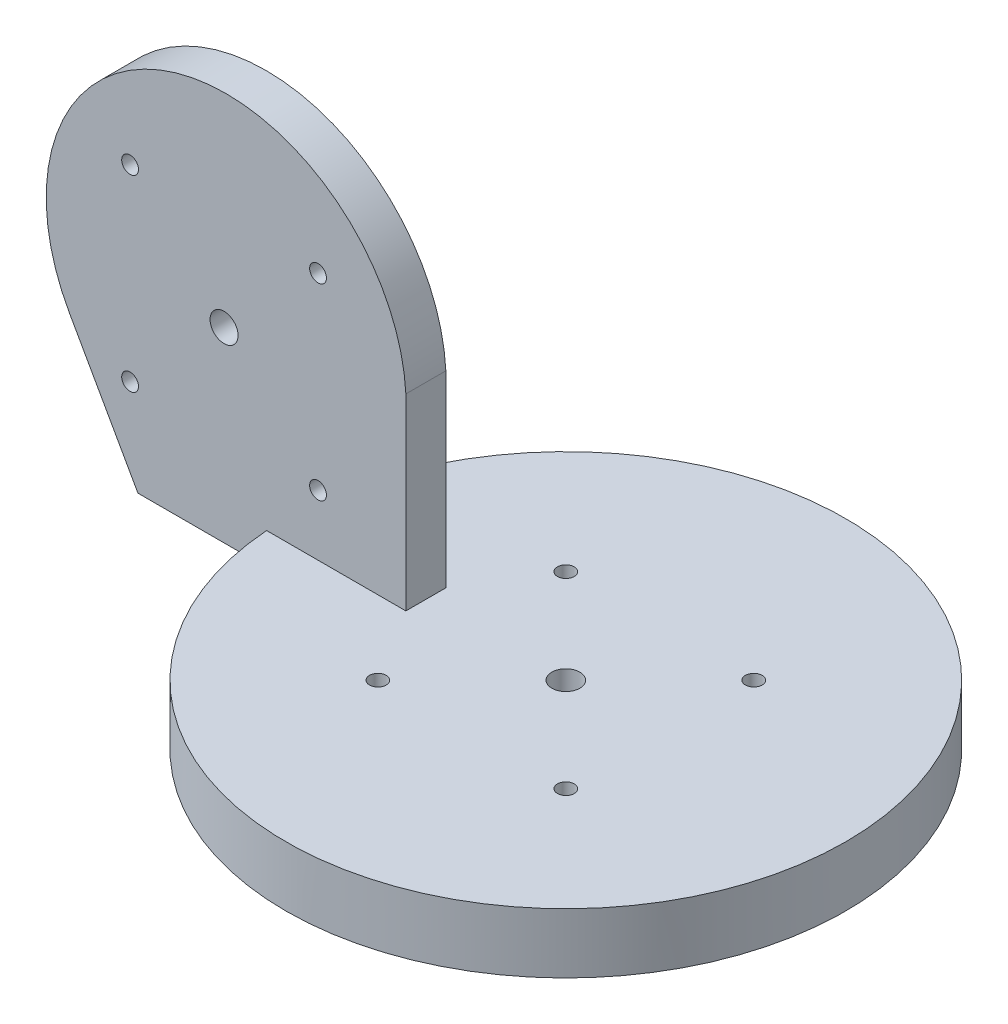
ISO-10303-21;
HEADER;
FILE_DESCRIPTION(('STEP AP214'),'2;1');
FILE_NAME('part.step','',(''),(''),'','','');
FILE_SCHEMA(('AUTOMOTIVE_DESIGN { 1 0 10303 214 1 1 1 1 }'));
ENDSEC;
DATA;
#1=APPLICATION_CONTEXT('core data for automotive mechanical design processes');
#2=APPLICATION_PROTOCOL_DEFINITION('international standard','automotive_design',2000,#1);
#3=PRODUCT_CONTEXT('',#1,'mechanical');
#4=PRODUCT('Part','Part','',(#3));
#5=PRODUCT_RELATED_PRODUCT_CATEGORY('part','',(#4));
#6=PRODUCT_DEFINITION_FORMATION('','',#4);
#7=PRODUCT_DEFINITION_CONTEXT('part definition',#1,'design');
#8=PRODUCT_DEFINITION('design','',#6,#7);
#9=PRODUCT_DEFINITION_SHAPE('','',#8);
#10=(LENGTH_UNIT() NAMED_UNIT(*) SI_UNIT(.MILLI.,.METRE.));
#11=(NAMED_UNIT(*) PLANE_ANGLE_UNIT() SI_UNIT($,.RADIAN.));
#12=(NAMED_UNIT(*) SI_UNIT($,.STERADIAN.) SOLID_ANGLE_UNIT());
#13=UNCERTAINTY_MEASURE_WITH_UNIT(LENGTH_MEASURE(1.E-05),#10,'distance_accuracy_value','');
#14=(GEOMETRIC_REPRESENTATION_CONTEXT(3) GLOBAL_UNCERTAINTY_ASSIGNED_CONTEXT((#13)) GLOBAL_UNIT_ASSIGNED_CONTEXT((#10,
#11,#12)) REPRESENTATION_CONTEXT('',''));
#15=CARTESIAN_POINT('',(0.,0.,0.));
#16=DIRECTION('',(0.,0.,1.));
#17=DIRECTION('',(1.,0.,0.));
#18=AXIS2_PLACEMENT_3D('',#15,#16,#17);
#19=CARTESIAN_POINT('',(0.,15.,0.));
#20=DIRECTION('',(0.,-1.,0.));
#21=DIRECTION('',(0.,0.,-1.));
#22=AXIS2_PLACEMENT_3D('',#19,#20,#21);
#23=CYLINDRICAL_SURFACE('',#22,70.);
#24=CARTESIAN_POINT('',(0.,0.,0.));
#25=DIRECTION('',(0.,1.,0.));
#26=DIRECTION('',(0.,0.,1.));
#27=AXIS2_PLACEMENT_3D('',#24,#25,#26);
#28=CIRCLE('',#27,70.);
#29=CARTESIAN_POINT('',(0.,0.,70.));
#30=VERTEX_POINT('',#29);
#31=EDGE_CURVE('E171',#30,#30,#28,.T.);
#32=ORIENTED_EDGE('',*,*,#31,.T.);
#33=EDGE_LOOP('',(#32));
#34=FACE_BOUND('',#33,.T.);
#35=DIRECTION('',(0.,-1.,0.));
#36=VECTOR('',#35,1.);
#37=CARTESIAN_POINT('',(-69.8212002188447,15.,5.));
#38=LINE('',#37,#36);
#39=CARTESIAN_POINT('',(-69.8212002188447,6.99999999999998,5.));
#40=VERTEX_POINT('',#39);
#41=CARTESIAN_POINT('',(-69.8212002188447,15.,5.));
#42=VERTEX_POINT('',#41);
#43=EDGE_CURVE('E54',#40,#42,#38,.F.);
#44=ORIENTED_EDGE('',*,*,#43,.F.);
#45=CARTESIAN_POINT('',(0.,7.,0.));
#46=DIRECTION('',(0.,-1.,0.));
#47=DIRECTION('',(1.,0.,0.));
#48=AXIS2_PLACEMENT_3D('',#45,#46,#47);
#49=CIRCLE('',#48,70.);
#50=CARTESIAN_POINT('',(-69.8212002188447,6.99999999999997,-5.));
#51=VERTEX_POINT('',#50);
#52=EDGE_CURVE('E11',#40,#51,#49,.T.);
#53=ORIENTED_EDGE('',*,*,#52,.T.);
#54=DIRECTION('',(0.,-1.,0.));
#55=VECTOR('',#54,1.);
#56=CARTESIAN_POINT('',(-69.8212002188447,15.,-5.));
#57=LINE('',#56,#55);
#58=CARTESIAN_POINT('',(-69.8212002188447,15.,-5.));
#59=VERTEX_POINT('',#58);
#60=EDGE_CURVE('E162',#51,#59,#57,.F.);
#61=ORIENTED_EDGE('',*,*,#60,.T.);
#62=CARTESIAN_POINT('',(0.,15.,0.));
#63=DIRECTION('',(0.,1.,0.));
#64=DIRECTION('',(0.,0.,1.));
#65=AXIS2_PLACEMENT_3D('',#62,#63,#64);
#66=CIRCLE('',#65,70.);
#67=EDGE_CURVE('E176',#42,#59,#66,.T.);
#68=ORIENTED_EDGE('',*,*,#67,.F.);
#69=EDGE_LOOP('',(#44,#53,#61,#68));
#70=FACE_BOUND('',#69,.T.);
#71=ADVANCED_FACE('F40',(#34,#70),#23,.T.);
#72=CARTESIAN_POINT('',(0.,15.,0.));
#73=DIRECTION('',(0.,1.,0.));
#74=DIRECTION('',(0.,0.,1.));
#75=AXIS2_PLACEMENT_3D('',#72,#73,#74);
#76=PLANE('',#75);
#77=CARTESIAN_POINT('',(0.,15.,0.));
#78=DIRECTION('',(0.,1.,0.));
#79=DIRECTION('',(0.,0.,1.));
#80=AXIS2_PLACEMENT_3D('',#77,#78,#79);
#81=CIRCLE('',#80,3.5);
#82=CARTESIAN_POINT('',(0.,15.,3.5));
#83=VERTEX_POINT('',#82);
#84=EDGE_CURVE('E336',#83,#83,#81,.T.);
#85=ORIENTED_EDGE('',*,*,#84,.F.);
#86=EDGE_LOOP('',(#85));
#87=FACE_BOUND('',#86,.T.);
#88=CARTESIAN_POINT('',(-23.5,15.,-23.5));
#89=DIRECTION('',(0.,1.,0.));
#90=DIRECTION('',(0.,0.,1.));
#91=AXIS2_PLACEMENT_3D('',#88,#89,#90);
#92=CIRCLE('',#91,2.09999999999999);
#93=CARTESIAN_POINT('',(-23.5,15.,-21.4));
#94=VERTEX_POINT('',#93);
#95=EDGE_CURVE('E112',#94,#94,#92,.T.);
#96=ORIENTED_EDGE('',*,*,#95,.F.);
#97=EDGE_LOOP('',(#96));
#98=FACE_BOUND('',#97,.T.);
#99=CARTESIAN_POINT('',(23.5,15.,-23.5));
#100=DIRECTION('',(0.,1.,0.));
#101=DIRECTION('',(0.,0.,1.));
#102=AXIS2_PLACEMENT_3D('',#99,#100,#101);
#103=CIRCLE('',#102,2.09999999999999);
#104=CARTESIAN_POINT('',(23.5,15.,-21.4));
#105=VERTEX_POINT('',#104);
#106=EDGE_CURVE('E111',#105,#105,#103,.T.);
#107=ORIENTED_EDGE('',*,*,#106,.F.);
#108=EDGE_LOOP('',(#107));
#109=FACE_BOUND('',#108,.T.);
#110=CARTESIAN_POINT('',(23.5,15.,23.5));
#111=DIRECTION('',(0.,1.,0.));
#112=DIRECTION('',(0.,0.,1.));
#113=AXIS2_PLACEMENT_3D('',#110,#111,#112);
#114=CIRCLE('',#113,2.09999999999999);
#115=CARTESIAN_POINT('',(23.5,15.,25.6));
#116=VERTEX_POINT('',#115);
#117=EDGE_CURVE('E124',#116,#116,#114,.T.);
#118=ORIENTED_EDGE('',*,*,#117,.F.);
#119=EDGE_LOOP('',(#118));
#120=FACE_BOUND('',#119,.T.);
#121=CARTESIAN_POINT('',(-23.5,15.,23.5));
#122=DIRECTION('',(0.,1.,0.));
#123=DIRECTION('',(0.,0.,1.));
#124=AXIS2_PLACEMENT_3D('',#121,#122,#123);
#125=CIRCLE('',#124,2.09999999999999);
#126=CARTESIAN_POINT('',(-23.5,15.,25.6));
#127=VERTEX_POINT('',#126);
#128=EDGE_CURVE('E130',#127,#127,#125,.T.);
#129=ORIENTED_EDGE('',*,*,#128,.F.);
#130=EDGE_LOOP('',(#129));
#131=FACE_BOUND('',#130,.T.);
#132=DIRECTION('',(0.,0.,-1.));
#133=VECTOR('',#132,1.);
#134=CARTESIAN_POINT('',(-35.,15.,0.));
#135=LINE('',#134,#133);
#136=CARTESIAN_POINT('',(-35.,15.,5.));
#137=VERTEX_POINT('',#136);
#138=CARTESIAN_POINT('',(-35.,15.,-5.));
#139=VERTEX_POINT('',#138);
#140=EDGE_CURVE('E182',#137,#139,#135,.T.);
#141=ORIENTED_EDGE('',*,*,#140,.F.);
#142=DIRECTION('',(-1.,0.,0.));
#143=VECTOR('',#142,1.);
#144=CARTESIAN_POINT('',(0.,15.,5.));
#145=LINE('',#144,#143);
#146=EDGE_CURVE('E48',#137,#42,#145,.T.);
#147=ORIENTED_EDGE('',*,*,#146,.T.);
#148=ORIENTED_EDGE('',*,*,#67,.T.);
#149=DIRECTION('',(-1.,0.,0.));
#150=VECTOR('',#149,1.);
#151=CARTESIAN_POINT('',(0.,15.,-5.));
#152=LINE('',#151,#150);
#153=EDGE_CURVE('E175',#139,#59,#152,.T.);
#154=ORIENTED_EDGE('',*,*,#153,.F.);
#155=EDGE_LOOP('',(#141,#147,#148,#154));
#156=FACE_BOUND('',#155,.T.);
#157=ADVANCED_FACE('F187',(#87,#98,#109,#120,#131,#156),#76,.T.);
#158=CARTESIAN_POINT('',(0.,0.,0.));
#159=DIRECTION('',(0.,1.,0.));
#160=DIRECTION('',(0.,0.,1.));
#161=AXIS2_PLACEMENT_3D('',#158,#159,#160);
#162=PLANE('',#161);
#163=CARTESIAN_POINT('',(0.,0.,0.));
#164=DIRECTION('',(0.,-1.,0.));
#165=DIRECTION('',(0.,0.,-1.));
#166=AXIS2_PLACEMENT_3D('',#163,#164,#165);
#167=CIRCLE('',#166,65.);
#168=CARTESIAN_POINT('',(0.,0.,-65.));
#169=VERTEX_POINT('',#168);
#170=EDGE_CURVE('E172',#169,#169,#167,.T.);
#171=ORIENTED_EDGE('',*,*,#170,.F.);
#172=EDGE_LOOP('',(#171));
#173=FACE_BOUND('',#172,.T.);
#174=ORIENTED_EDGE('',*,*,#31,.F.);
#175=EDGE_LOOP('',(#174));
#176=FACE_BOUND('',#175,.T.);
#177=ADVANCED_FACE('F226',(#173,#176),#162,.F.);
#178=CARTESIAN_POINT('',(0.,-3.,0.));
#179=DIRECTION('',(0.,1.,0.));
#180=DIRECTION('',(0.,0.,1.));
#181=AXIS2_PLACEMENT_3D('',#178,#179,#180);
#182=CYLINDRICAL_SURFACE('',#181,65.);
#183=CARTESIAN_POINT('',(0.,-3.,0.));
#184=DIRECTION('',(0.,-1.,0.));
#185=DIRECTION('',(0.,0.,-1.));
#186=AXIS2_PLACEMENT_3D('',#183,#184,#185);
#187=CIRCLE('',#186,65.);
#188=CARTESIAN_POINT('',(0.,-3.,-65.));
#189=VERTEX_POINT('',#188);
#190=EDGE_CURVE('E168',#189,#189,#187,.T.);
#191=ORIENTED_EDGE('',*,*,#190,.F.);
#192=EDGE_LOOP('',(#191));
#193=FACE_BOUND('',#192,.T.);
#194=ORIENTED_EDGE('',*,*,#170,.T.);
#195=EDGE_LOOP('',(#194));
#196=FACE_BOUND('',#195,.T.);
#197=ADVANCED_FACE('F232',(#193,#196),#182,.T.);
#198=CARTESIAN_POINT('',(0.,-3.,0.));
#199=DIRECTION('',(0.,-1.,0.));
#200=DIRECTION('',(0.,0.,-1.));
#201=AXIS2_PLACEMENT_3D('',#198,#199,#200);
#202=PLANE('',#201);
#203=CARTESIAN_POINT('',(0.,-3.,0.));
#204=DIRECTION('',(0.,1.,0.));
#205=DIRECTION('',(0.,0.,1.));
#206=AXIS2_PLACEMENT_3D('',#203,#204,#205);
#207=CIRCLE('',#206,3.5);
#208=CARTESIAN_POINT('',(0.,-3.,3.5));
#209=VERTEX_POINT('',#208);
#210=EDGE_CURVE('E118',#209,#209,#207,.T.);
#211=ORIENTED_EDGE('',*,*,#210,.T.);
#212=EDGE_LOOP('',(#211));
#213=FACE_BOUND('',#212,.T.);
#214=ORIENTED_EDGE('',*,*,#190,.T.);
#215=EDGE_LOOP('',(#214));
#216=FACE_BOUND('',#215,.T.);
#217=ADVANCED_FACE('F237',(#213,#216),#202,.T.);
#218=CARTESIAN_POINT('',(-79.9340796398505,59.5651515612724,5.));
#219=DIRECTION('',(0.,0.,-1.));
#220=DIRECTION('',(-1.,0.,0.));
#221=AXIS2_PLACEMENT_3D('',#218,#219,#220);
#222=PLANE('',#221);
#223=CARTESIAN_POINT('',(-80.460351620351,53.6603770769091,5.));
#224=DIRECTION('',(0.,0.,1.));
#225=DIRECTION('',(1.,0.,0.));
#226=AXIS2_PLACEMENT_3D('',#223,#224,#225);
#227=CIRCLE('',#226,3.49999999999999);
#228=CARTESIAN_POINT('',(-76.960351620351,53.6603770769091,5.));
#229=VERTEX_POINT('',#228);
#230=EDGE_CURVE('E309',#229,#229,#227,.T.);
#231=ORIENTED_EDGE('',*,*,#230,.F.);
#232=EDGE_LOOP('',(#231));
#233=FACE_BOUND('',#232,.T.);
#234=CARTESIAN_POINT('',(-103.960351620351,77.1603770769091,5.));
#235=DIRECTION('',(0.,0.,1.));
#236=DIRECTION('',(1.,0.,0.));
#237=AXIS2_PLACEMENT_3D('',#234,#235,#236);
#238=CIRCLE('',#237,2.09999999999999);
#239=CARTESIAN_POINT('',(-101.860351620351,77.1603770769091,5.));
#240=VERTEX_POINT('',#239);
#241=EDGE_CURVE('E311',#240,#240,#238,.T.);
#242=ORIENTED_EDGE('',*,*,#241,.F.);
#243=EDGE_LOOP('',(#242));
#244=FACE_BOUND('',#243,.T.);
#245=CARTESIAN_POINT('',(-56.960351620351,77.1603770769091,5.));
#246=DIRECTION('',(0.,0.,1.));
#247=DIRECTION('',(1.,0.,0.));
#248=AXIS2_PLACEMENT_3D('',#245,#246,#247);
#249=CIRCLE('',#248,2.09999999999999);
#250=CARTESIAN_POINT('',(-54.860351620351,77.1603770769091,5.));
#251=VERTEX_POINT('',#250);
#252=EDGE_CURVE('E318',#251,#251,#249,.T.);
#253=ORIENTED_EDGE('',*,*,#252,.F.);
#254=EDGE_LOOP('',(#253));
#255=FACE_BOUND('',#254,.T.);
#256=CARTESIAN_POINT('',(-56.960351620351,30.1603770769091,5.));
#257=DIRECTION('',(0.,0.,1.));
#258=DIRECTION('',(1.,0.,0.));
#259=AXIS2_PLACEMENT_3D('',#256,#257,#258);
#260=CIRCLE('',#259,2.09999999999999);
#261=CARTESIAN_POINT('',(-54.860351620351,30.1603770769091,5.));
#262=VERTEX_POINT('',#261);
#263=EDGE_CURVE('E324',#262,#262,#260,.T.);
#264=ORIENTED_EDGE('',*,*,#263,.F.);
#265=EDGE_LOOP('',(#264));
#266=FACE_BOUND('',#265,.T.);
#267=CARTESIAN_POINT('',(-103.960351620351,30.1603770769091,5.));
#268=DIRECTION('',(0.,0.,1.));
#269=DIRECTION('',(1.,0.,0.));
#270=AXIS2_PLACEMENT_3D('',#267,#268,#269);
#271=CIRCLE('',#270,2.09999999999999);
#272=CARTESIAN_POINT('',(-101.860351620351,30.1603770769091,5.));
#273=VERTEX_POINT('',#272);
#274=EDGE_CURVE('E330',#273,#273,#271,.T.);
#275=ORIENTED_EDGE('',*,*,#274,.F.);
#276=EDGE_LOOP('',(#275));
#277=FACE_BOUND('',#276,.T.);
#278=DIRECTION('',(-1.,0.,0.));
#279=VECTOR('',#278,1.);
#280=CARTESIAN_POINT('',(-35.,6.99999999999999,5.));
#281=LINE('',#280,#279);
#282=CARTESIAN_POINT('',(-102.,6.99999999999997,5.));
#283=VERTEX_POINT('',#282);
#284=EDGE_CURVE('E147',#40,#283,#281,.T.);
#285=ORIENTED_EDGE('',*,*,#284,.F.);
#286=ORIENTED_EDGE('',*,*,#43,.T.);
#287=ORIENTED_EDGE('',*,*,#146,.F.);
#288=DIRECTION('',(0.,-1.,0.));
#289=VECTOR('',#288,1.);
#290=CARTESIAN_POINT('',(-35.,62.,5.));
#291=LINE('',#290,#289);
#292=CARTESIAN_POINT('',(-35.,62.,5.));
#293=VERTEX_POINT('',#292);
#294=EDGE_CURVE('E144',#293,#137,#291,.T.);
#295=ORIENTED_EDGE('',*,*,#294,.F.);
#296=CARTESIAN_POINT('',(-79.9340796398505,59.5651515612724,5.));
#297=DIRECTION('',(0.,0.,-1.));
#298=DIRECTION('',(-1.,0.,0.));
#299=AXIS2_PLACEMENT_3D('',#296,#297,#298);
#300=CIRCLE('',#299,45.);
#301=CARTESIAN_POINT('',(-119.156726543945,37.5065031476289,5.));
#302=VERTEX_POINT('',#301);
#303=EDGE_CURVE('E140',#302,#293,#300,.T.);
#304=ORIENTED_EDGE('',*,*,#303,.F.);
#305=DIRECTION('',(-0.490192186969854,0.871614375646542,0.));
#306=VECTOR('',#305,1.);
#307=CARTESIAN_POINT('',(-102.,6.99999999999997,5.));
#308=LINE('',#307,#306);
#309=EDGE_CURVE('E137',#283,#302,#308,.T.);
#310=ORIENTED_EDGE('',*,*,#309,.F.);
#311=EDGE_LOOP('',(#285,#286,#287,#295,#304,#310));
#312=FACE_BOUND('',#311,.T.);
#313=ADVANCED_FACE('F191',(#233,#244,#255,#266,#277,#312),#222,.F.);
#314=CARTESIAN_POINT('',(-79.9340796398505,59.5651515612724,-5.));
#315=DIRECTION('',(0.,0.,-1.));
#316=DIRECTION('',(-1.,0.,0.));
#317=AXIS2_PLACEMENT_3D('',#314,#315,#316);
#318=PLANE('',#317);
#319=CARTESIAN_POINT('',(-80.460351620351,53.6603770769091,-5.));
#320=DIRECTION('',(0.,0.,-1.));
#321=DIRECTION('',(-1.,0.,0.));
#322=AXIS2_PLACEMENT_3D('',#319,#320,#321);
#323=CIRCLE('',#322,3.49999999999999);
#324=CARTESIAN_POINT('',(-83.960351620351,53.6603770769091,-5.));
#325=VERTEX_POINT('',#324);
#326=EDGE_CURVE('E43',#325,#325,#323,.T.);
#327=ORIENTED_EDGE('',*,*,#326,.F.);
#328=EDGE_LOOP('',(#327));
#329=FACE_BOUND('',#328,.T.);
#330=CARTESIAN_POINT('',(-103.960351620351,77.1603770769091,-5.));
#331=DIRECTION('',(0.,0.,1.));
#332=DIRECTION('',(1.,0.,0.));
#333=AXIS2_PLACEMENT_3D('',#330,#331,#332);
#334=CIRCLE('',#333,2.1);
#335=CARTESIAN_POINT('',(-101.860351620351,77.1603770769091,-5.));
#336=VERTEX_POINT('',#335);
#337=EDGE_CURVE('E315',#336,#336,#334,.T.);
#338=ORIENTED_EDGE('',*,*,#337,.T.);
#339=EDGE_LOOP('',(#338));
#340=FACE_BOUND('',#339,.T.);
#341=CARTESIAN_POINT('',(-56.960351620351,77.1603770769091,-5.));
#342=DIRECTION('',(0.,0.,1.));
#343=DIRECTION('',(1.,0.,0.));
#344=AXIS2_PLACEMENT_3D('',#341,#342,#343);
#345=CIRCLE('',#344,2.1);
#346=CARTESIAN_POINT('',(-54.860351620351,77.1603770769091,-5.));
#347=VERTEX_POINT('',#346);
#348=EDGE_CURVE('E321',#347,#347,#345,.T.);
#349=ORIENTED_EDGE('',*,*,#348,.T.);
#350=EDGE_LOOP('',(#349));
#351=FACE_BOUND('',#350,.T.);
#352=CARTESIAN_POINT('',(-56.960351620351,30.1603770769091,-5.));
#353=DIRECTION('',(0.,0.,1.));
#354=DIRECTION('',(1.,0.,0.));
#355=AXIS2_PLACEMENT_3D('',#352,#353,#354);
#356=CIRCLE('',#355,2.1);
#357=CARTESIAN_POINT('',(-54.860351620351,30.1603770769091,-5.));
#358=VERTEX_POINT('',#357);
#359=EDGE_CURVE('E327',#358,#358,#356,.T.);
#360=ORIENTED_EDGE('',*,*,#359,.T.);
#361=EDGE_LOOP('',(#360));
#362=FACE_BOUND('',#361,.T.);
#363=CARTESIAN_POINT('',(-103.960351620351,30.1603770769091,-5.));
#364=DIRECTION('',(0.,0.,1.));
#365=DIRECTION('',(1.,0.,0.));
#366=AXIS2_PLACEMENT_3D('',#363,#364,#365);
#367=CIRCLE('',#366,2.1);
#368=CARTESIAN_POINT('',(-101.860351620351,30.1603770769091,-5.));
#369=VERTEX_POINT('',#368);
#370=EDGE_CURVE('E333',#369,#369,#367,.T.);
#371=ORIENTED_EDGE('',*,*,#370,.T.);
#372=EDGE_LOOP('',(#371));
#373=FACE_BOUND('',#372,.T.);
#374=ORIENTED_EDGE('',*,*,#60,.F.);
#375=DIRECTION('',(-1.,0.,0.));
#376=VECTOR('',#375,1.);
#377=CARTESIAN_POINT('',(-35.,6.99999999999999,-5.));
#378=LINE('',#377,#376);
#379=CARTESIAN_POINT('',(-102.,6.99999999999997,-5.));
#380=VERTEX_POINT('',#379);
#381=EDGE_CURVE('E141',#51,#380,#378,.T.);
#382=ORIENTED_EDGE('',*,*,#381,.T.);
#383=DIRECTION('',(-0.490192186969854,0.871614375646542,0.));
#384=VECTOR('',#383,1.);
#385=CARTESIAN_POINT('',(-102.,6.99999999999997,-5.));
#386=LINE('',#385,#384);
#387=CARTESIAN_POINT('',(-119.156726543945,37.5065031476289,-5.));
#388=VERTEX_POINT('',#387);
#389=EDGE_CURVE('E136',#380,#388,#386,.T.);
#390=ORIENTED_EDGE('',*,*,#389,.T.);
#391=CARTESIAN_POINT('',(-79.9340796398505,59.5651515612724,-5.));
#392=DIRECTION('',(0.,0.,-1.));
#393=DIRECTION('',(-1.,0.,0.));
#394=AXIS2_PLACEMENT_3D('',#391,#392,#393);
#395=CIRCLE('',#394,45.);
#396=CARTESIAN_POINT('',(-35.,62.,-5.));
#397=VERTEX_POINT('',#396);
#398=EDGE_CURVE('E152',#388,#397,#395,.T.);
#399=ORIENTED_EDGE('',*,*,#398,.T.);
#400=DIRECTION('',(0.,-1.,0.));
#401=VECTOR('',#400,1.);
#402=CARTESIAN_POINT('',(-35.,62.,-5.));
#403=LINE('',#402,#401);
#404=EDGE_CURVE('E155',#397,#139,#403,.T.);
#405=ORIENTED_EDGE('',*,*,#404,.T.);
#406=ORIENTED_EDGE('',*,*,#153,.T.);
#407=EDGE_LOOP('',(#374,#382,#390,#399,#405,#406));
#408=FACE_BOUND('',#407,.T.);
#409=ADVANCED_FACE('F203',(#329,#340,#351,#362,#373,#408),#318,.T.);
#410=CARTESIAN_POINT('',(-102.,6.99999999999997,5.));
#411=DIRECTION('',(-0.871614375646542,-0.490192186969854,0.));
#412=DIRECTION('',(0.490192186969854,-0.871614375646542,0.));
#413=AXIS2_PLACEMENT_3D('',#410,#411,#412);
#414=PLANE('',#413);
#415=ORIENTED_EDGE('',*,*,#389,.F.);
#416=DIRECTION('',(0.,0.,-1.));
#417=VECTOR('',#416,1.);
#418=CARTESIAN_POINT('',(-102.,6.99999999999997,5.));
#419=LINE('',#418,#417);
#420=EDGE_CURVE('E159',#283,#380,#419,.T.);
#421=ORIENTED_EDGE('',*,*,#420,.F.);
#422=ORIENTED_EDGE('',*,*,#309,.T.);
#423=DIRECTION('',(0.,0.,-1.));
#424=VECTOR('',#423,1.);
#425=CARTESIAN_POINT('',(-119.156726543945,37.5065031476289,5.));
#426=LINE('',#425,#424);
#427=EDGE_CURVE('E149',#302,#388,#426,.T.);
#428=ORIENTED_EDGE('',*,*,#427,.T.);
#429=EDGE_LOOP('',(#415,#421,#422,#428));
#430=FACE_BOUND('',#429,.T.);
#431=ADVANCED_FACE('F200',(#430),#414,.T.);
#432=CARTESIAN_POINT('',(-35.,6.99999999999999,5.));
#433=DIRECTION('',(0.,-1.,0.));
#434=DIRECTION('',(1.,0.,0.));
#435=AXIS2_PLACEMENT_3D('',#432,#433,#434);
#436=PLANE('',#435);
#437=ORIENTED_EDGE('',*,*,#52,.F.);
#438=ORIENTED_EDGE('',*,*,#284,.T.);
#439=ORIENTED_EDGE('',*,*,#420,.T.);
#440=ORIENTED_EDGE('',*,*,#381,.F.);
#441=EDGE_LOOP('',(#437,#438,#439,#440));
#442=FACE_BOUND('',#441,.T.);
#443=ADVANCED_FACE('F196',(#442),#436,.T.);
#444=CARTESIAN_POINT('',(-35.,62.,5.));
#445=DIRECTION('',(1.,0.,0.));
#446=DIRECTION('',(0.,1.,0.));
#447=AXIS2_PLACEMENT_3D('',#444,#445,#446);
#448=PLANE('',#447);
#449=ORIENTED_EDGE('',*,*,#294,.T.);
#450=ORIENTED_EDGE('',*,*,#140,.T.);
#451=ORIENTED_EDGE('',*,*,#404,.F.);
#452=DIRECTION('',(0.,0.,-1.));
#453=VECTOR('',#452,1.);
#454=CARTESIAN_POINT('',(-35.,62.,5.));
#455=LINE('',#454,#453);
#456=EDGE_CURVE('E163',#293,#397,#455,.T.);
#457=ORIENTED_EDGE('',*,*,#456,.F.);
#458=EDGE_LOOP('',(#449,#450,#451,#457));
#459=FACE_BOUND('',#458,.T.);
#460=ADVANCED_FACE('F206',(#459),#448,.T.);
#461=CARTESIAN_POINT('',(-79.9340796398505,59.5651515612724,5.));
#462=DIRECTION('',(0.,0.,-1.));
#463=DIRECTION('',(-1.,0.,0.));
#464=AXIS2_PLACEMENT_3D('',#461,#462,#463);
#465=CYLINDRICAL_SURFACE('',#464,45.);
#466=ORIENTED_EDGE('',*,*,#398,.F.);
#467=ORIENTED_EDGE('',*,*,#427,.F.);
#468=ORIENTED_EDGE('',*,*,#303,.T.);
#469=ORIENTED_EDGE('',*,*,#456,.T.);
#470=EDGE_LOOP('',(#466,#467,#468,#469));
#471=FACE_BOUND('',#470,.T.);
#472=ADVANCED_FACE('F208',(#471),#465,.T.);
#473=CARTESIAN_POINT('',(-23.5,5.,23.5));
#474=DIRECTION('',(0.,1.,0.));
#475=DIRECTION('',(0.,0.,1.));
#476=AXIS2_PLACEMENT_3D('',#473,#474,#475);
#477=CONICAL_SURFACE('',#476,2.1,1.02974425867665);
#478=CARTESIAN_POINT('',(-23.5,3.73819270004212,23.5));
#479=VERTEX_POINT('',#478);
#480=VERTEX_LOOP('',#479);
#481=FACE_BOUND('',#480,.T.);
#482=CARTESIAN_POINT('',(-23.5,5.,23.5));
#483=DIRECTION('',(0.,1.,0.));
#484=DIRECTION('',(0.,0.,1.));
#485=AXIS2_PLACEMENT_3D('',#482,#483,#484);
#486=CIRCLE('',#485,2.1);
#487=CARTESIAN_POINT('',(-23.5,5.,25.6));
#488=VERTEX_POINT('',#487);
#489=EDGE_CURVE('E133',#488,#488,#486,.T.);
#490=ORIENTED_EDGE('',*,*,#489,.T.);
#491=EDGE_LOOP('',(#490));
#492=FACE_BOUND('',#491,.T.);
#493=ADVANCED_FACE('F210',(#481,#492),#477,.F.);
#494=CARTESIAN_POINT('',(-23.5,15.,23.5));
#495=DIRECTION('',(0.,1.,0.));
#496=DIRECTION('',(0.,0.,1.));
#497=AXIS2_PLACEMENT_3D('',#494,#495,#496);
#498=CYLINDRICAL_SURFACE('',#497,2.09999999999999);
#499=ORIENTED_EDGE('',*,*,#489,.F.);
#500=EDGE_LOOP('',(#499));
#501=FACE_BOUND('',#500,.T.);
#502=ORIENTED_EDGE('',*,*,#128,.T.);
#503=EDGE_LOOP('',(#502));
#504=FACE_BOUND('',#503,.T.);
#505=ADVANCED_FACE('F216',(#501,#504),#498,.F.);
#506=CARTESIAN_POINT('',(23.5,5.,23.5));
#507=DIRECTION('',(0.,1.,0.));
#508=DIRECTION('',(0.,0.,1.));
#509=AXIS2_PLACEMENT_3D('',#506,#507,#508);
#510=CONICAL_SURFACE('',#509,2.1,1.02974425867665);
#511=CARTESIAN_POINT('',(23.5,3.73819270004212,23.5));
#512=VERTEX_POINT('',#511);
#513=VERTEX_LOOP('',#512);
#514=FACE_BOUND('',#513,.T.);
#515=CARTESIAN_POINT('',(23.5,5.,23.5));
#516=DIRECTION('',(0.,1.,0.));
#517=DIRECTION('',(0.,0.,1.));
#518=AXIS2_PLACEMENT_3D('',#515,#516,#517);
#519=CIRCLE('',#518,2.1);
#520=CARTESIAN_POINT('',(23.5,5.,25.6));
#521=VERTEX_POINT('',#520);
#522=EDGE_CURVE('E127',#521,#521,#519,.T.);
#523=ORIENTED_EDGE('',*,*,#522,.T.);
#524=EDGE_LOOP('',(#523));
#525=FACE_BOUND('',#524,.T.);
#526=ADVANCED_FACE('F262',(#514,#525),#510,.F.);
#527=CARTESIAN_POINT('',(23.5,15.,23.5));
#528=DIRECTION('',(0.,1.,0.));
#529=DIRECTION('',(0.,0.,1.));
#530=AXIS2_PLACEMENT_3D('',#527,#528,#529);
#531=CYLINDRICAL_SURFACE('',#530,2.09999999999999);
#532=ORIENTED_EDGE('',*,*,#522,.F.);
#533=EDGE_LOOP('',(#532));
#534=FACE_BOUND('',#533,.T.);
#535=ORIENTED_EDGE('',*,*,#117,.T.);
#536=EDGE_LOOP('',(#535));
#537=FACE_BOUND('',#536,.T.);
#538=ADVANCED_FACE('F266',(#534,#537),#531,.F.);
#539=CARTESIAN_POINT('',(23.5,5.,-23.5));
#540=DIRECTION('',(0.,1.,0.));
#541=DIRECTION('',(0.,0.,1.));
#542=AXIS2_PLACEMENT_3D('',#539,#540,#541);
#543=CONICAL_SURFACE('',#542,2.1,1.02974425867665);
#544=CARTESIAN_POINT('',(23.5,3.73819270004212,-23.5));
#545=VERTEX_POINT('',#544);
#546=VERTEX_LOOP('',#545);
#547=FACE_BOUND('',#546,.T.);
#548=CARTESIAN_POINT('',(23.5,5.,-23.5));
#549=DIRECTION('',(0.,1.,0.));
#550=DIRECTION('',(0.,0.,1.));
#551=AXIS2_PLACEMENT_3D('',#548,#549,#550);
#552=CIRCLE('',#551,2.1);
#553=CARTESIAN_POINT('',(23.5,5.,-21.4));
#554=VERTEX_POINT('',#553);
#555=EDGE_CURVE('E115',#554,#554,#552,.T.);
#556=ORIENTED_EDGE('',*,*,#555,.T.);
#557=EDGE_LOOP('',(#556));
#558=FACE_BOUND('',#557,.T.);
#559=ADVANCED_FACE('F270',(#547,#558),#543,.F.);
#560=CARTESIAN_POINT('',(23.5,15.,-23.5));
#561=DIRECTION('',(0.,1.,0.));
#562=DIRECTION('',(0.,0.,1.));
#563=AXIS2_PLACEMENT_3D('',#560,#561,#562);
#564=CYLINDRICAL_SURFACE('',#563,2.09999999999999);
#565=ORIENTED_EDGE('',*,*,#555,.F.);
#566=EDGE_LOOP('',(#565));
#567=FACE_BOUND('',#566,.T.);
#568=ORIENTED_EDGE('',*,*,#106,.T.);
#569=EDGE_LOOP('',(#568));
#570=FACE_BOUND('',#569,.T.);
#571=ADVANCED_FACE('F105',(#567,#570),#564,.F.);
#572=CARTESIAN_POINT('',(-23.5,5.,-23.5));
#573=DIRECTION('',(0.,1.,0.));
#574=DIRECTION('',(0.,0.,1.));
#575=AXIS2_PLACEMENT_3D('',#572,#573,#574);
#576=CONICAL_SURFACE('',#575,2.1,1.02974425867665);
#577=CARTESIAN_POINT('',(-23.5,3.73819270004212,-23.5));
#578=VERTEX_POINT('',#577);
#579=VERTEX_LOOP('',#578);
#580=FACE_BOUND('',#579,.T.);
#581=CARTESIAN_POINT('',(-23.5,5.,-23.5));
#582=DIRECTION('',(0.,1.,0.));
#583=DIRECTION('',(0.,0.,1.));
#584=AXIS2_PLACEMENT_3D('',#581,#582,#583);
#585=CIRCLE('',#584,2.1);
#586=CARTESIAN_POINT('',(-23.5,5.,-21.4));
#587=VERTEX_POINT('',#586);
#588=EDGE_CURVE('E109',#587,#587,#585,.T.);
#589=ORIENTED_EDGE('',*,*,#588,.T.);
#590=EDGE_LOOP('',(#589));
#591=FACE_BOUND('',#590,.T.);
#592=ADVANCED_FACE('F101',(#580,#591),#576,.F.);
#593=CARTESIAN_POINT('',(-23.5,15.,-23.5));
#594=DIRECTION('',(0.,1.,0.));
#595=DIRECTION('',(0.,0.,1.));
#596=AXIS2_PLACEMENT_3D('',#593,#594,#595);
#597=CYLINDRICAL_SURFACE('',#596,2.09999999999999);
#598=ORIENTED_EDGE('',*,*,#588,.F.);
#599=EDGE_LOOP('',(#598));
#600=FACE_BOUND('',#599,.T.);
#601=ORIENTED_EDGE('',*,*,#95,.T.);
#602=EDGE_LOOP('',(#601));
#603=FACE_BOUND('',#602,.T.);
#604=ADVANCED_FACE('F104',(#600,#603),#597,.F.);
#605=CARTESIAN_POINT('',(0.,-3.,0.));
#606=DIRECTION('',(0.,1.,0.));
#607=DIRECTION('',(0.,0.,1.));
#608=AXIS2_PLACEMENT_3D('',#605,#606,#607);
#609=CYLINDRICAL_SURFACE('',#608,3.5);
#610=ORIENTED_EDGE('',*,*,#210,.F.);
#611=EDGE_LOOP('',(#610));
#612=FACE_BOUND('',#611,.T.);
#613=ORIENTED_EDGE('',*,*,#84,.T.);
#614=EDGE_LOOP('',(#613));
#615=FACE_BOUND('',#614,.T.);
#616=ADVANCED_FACE('F280',(#612,#615),#609,.F.);
#617=CARTESIAN_POINT('',(-103.960351620351,30.1603770769091,5.));
#618=DIRECTION('',(0.,0.,1.));
#619=DIRECTION('',(1.,0.,0.));
#620=AXIS2_PLACEMENT_3D('',#617,#618,#619);
#621=CYLINDRICAL_SURFACE('',#620,2.1);
#622=ORIENTED_EDGE('',*,*,#370,.F.);
#623=EDGE_LOOP('',(#622));
#624=FACE_BOUND('',#623,.T.);
#625=ORIENTED_EDGE('',*,*,#274,.T.);
#626=EDGE_LOOP('',(#625));
#627=FACE_BOUND('',#626,.T.);
#628=ADVANCED_FACE('F283',(#624,#627),#621,.F.);
#629=CARTESIAN_POINT('',(-56.960351620351,30.1603770769091,5.));
#630=DIRECTION('',(0.,0.,1.));
#631=DIRECTION('',(1.,0.,0.));
#632=AXIS2_PLACEMENT_3D('',#629,#630,#631);
#633=CYLINDRICAL_SURFACE('',#632,2.09999999999999);
#634=ORIENTED_EDGE('',*,*,#359,.F.);
#635=EDGE_LOOP('',(#634));
#636=FACE_BOUND('',#635,.T.);
#637=ORIENTED_EDGE('',*,*,#263,.T.);
#638=EDGE_LOOP('',(#637));
#639=FACE_BOUND('',#638,.T.);
#640=ADVANCED_FACE('F287',(#636,#639),#633,.F.);
#641=CARTESIAN_POINT('',(-56.960351620351,77.1603770769091,5.));
#642=DIRECTION('',(0.,0.,1.));
#643=DIRECTION('',(1.,0.,0.));
#644=AXIS2_PLACEMENT_3D('',#641,#642,#643);
#645=CYLINDRICAL_SURFACE('',#644,2.09999999999999);
#646=ORIENTED_EDGE('',*,*,#348,.F.);
#647=EDGE_LOOP('',(#646));
#648=FACE_BOUND('',#647,.T.);
#649=ORIENTED_EDGE('',*,*,#252,.T.);
#650=EDGE_LOOP('',(#649));
#651=FACE_BOUND('',#650,.T.);
#652=ADVANCED_FACE('F291',(#648,#651),#645,.F.);
#653=CARTESIAN_POINT('',(-103.960351620351,77.1603770769091,5.));
#654=DIRECTION('',(0.,0.,1.));
#655=DIRECTION('',(1.,0.,0.));
#656=AXIS2_PLACEMENT_3D('',#653,#654,#655);
#657=CYLINDRICAL_SURFACE('',#656,2.1);
#658=ORIENTED_EDGE('',*,*,#337,.F.);
#659=EDGE_LOOP('',(#658));
#660=FACE_BOUND('',#659,.T.);
#661=ORIENTED_EDGE('',*,*,#241,.T.);
#662=EDGE_LOOP('',(#661));
#663=FACE_BOUND('',#662,.T.);
#664=ADVANCED_FACE('F295',(#660,#663),#657,.F.);
#665=CARTESIAN_POINT('',(-80.460351620351,53.6603770769091,-70.));
#666=DIRECTION('',(0.,0.,1.));
#667=DIRECTION('',(1.,0.,0.));
#668=AXIS2_PLACEMENT_3D('',#665,#666,#667);
#669=CYLINDRICAL_SURFACE('',#668,3.49999999999999);
#670=ORIENTED_EDGE('',*,*,#326,.T.);
#671=EDGE_LOOP('',(#670));
#672=FACE_BOUND('',#671,.T.);
#673=ORIENTED_EDGE('',*,*,#230,.T.);
#674=EDGE_LOOP('',(#673));
#675=FACE_BOUND('',#674,.T.);
#676=ADVANCED_FACE('F299',(#672,#675),#669,.F.);
#677=CLOSED_SHELL('',(#71,#157,#177,#197,#217,#313,#409,#431,#443,#460,#472,#493,#505,#526,#538,
#559,#571,#592,#604,#616,#628,#640,#652,#664,#676));
#678=MANIFOLD_SOLID_BREP('B2',#677);
#679=ADVANCED_BREP_SHAPE_REPRESENTATION('',(#18,#678),#14);
#680=SHAPE_DEFINITION_REPRESENTATION(#9,#679);
ENDSEC;
END-ISO-10303-21;
